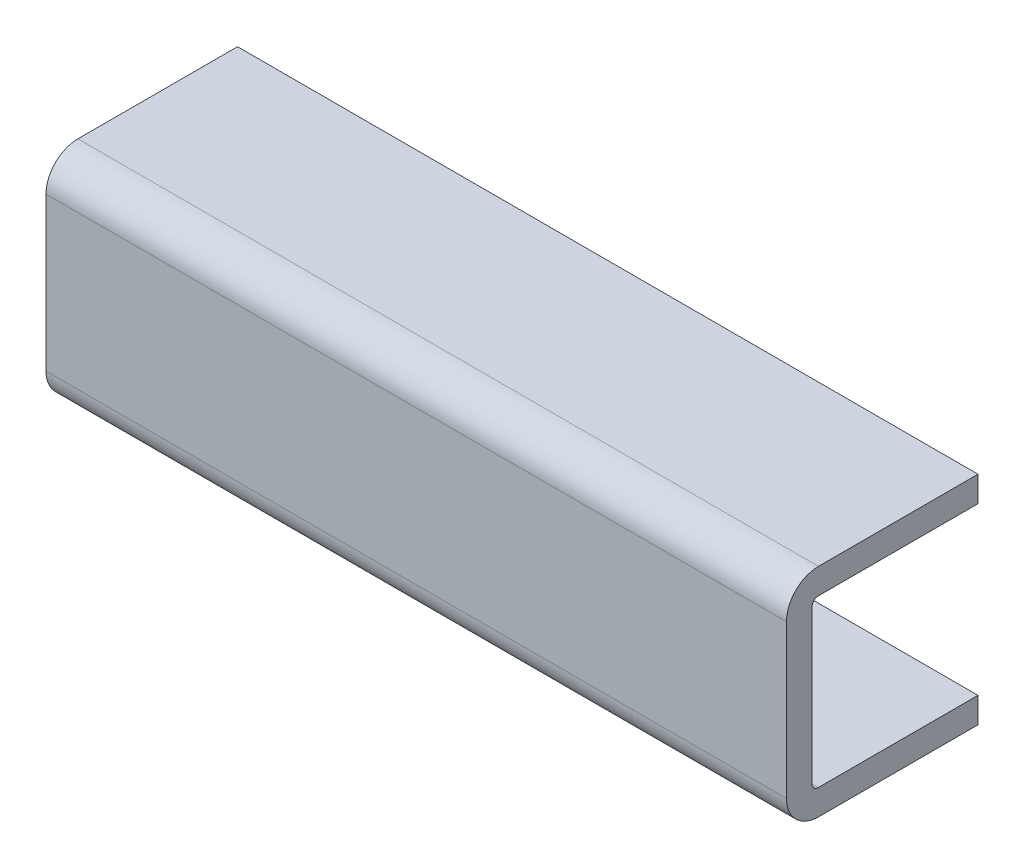
ISO-10303-21;
HEADER;
FILE_DESCRIPTION(('STEP AP214'),'2;1');
FILE_NAME('part.step','',(''),(''),'','','');
FILE_SCHEMA(('AUTOMOTIVE_DESIGN { 1 0 10303 214 1 1 1 1 }'));
ENDSEC;
DATA;
#1=APPLICATION_CONTEXT('core data for automotive mechanical design processes');
#2=APPLICATION_PROTOCOL_DEFINITION('international standard','automotive_design',2000,#1);
#3=PRODUCT_CONTEXT('',#1,'mechanical');
#4=PRODUCT('Part','Part','',(#3));
#5=PRODUCT_RELATED_PRODUCT_CATEGORY('part','',(#4));
#6=PRODUCT_DEFINITION_FORMATION('','',#4);
#7=PRODUCT_DEFINITION_CONTEXT('part definition',#1,'design');
#8=PRODUCT_DEFINITION('design','',#6,#7);
#9=PRODUCT_DEFINITION_SHAPE('','',#8);
#10=(LENGTH_UNIT() NAMED_UNIT(*) SI_UNIT(.MILLI.,.METRE.));
#11=(NAMED_UNIT(*) PLANE_ANGLE_UNIT() SI_UNIT($,.RADIAN.));
#12=(NAMED_UNIT(*) SI_UNIT($,.STERADIAN.) SOLID_ANGLE_UNIT());
#13=UNCERTAINTY_MEASURE_WITH_UNIT(LENGTH_MEASURE(1.E-05),#10,'distance_accuracy_value','');
#14=(GEOMETRIC_REPRESENTATION_CONTEXT(3) GLOBAL_UNCERTAINTY_ASSIGNED_CONTEXT((#13)) GLOBAL_UNIT_ASSIGNED_CONTEXT((#10,
#11,#12)) REPRESENTATION_CONTEXT('',''));
#15=CARTESIAN_POINT('',(0.,0.,0.));
#16=DIRECTION('',(0.,0.,1.));
#17=DIRECTION('',(1.,0.,0.));
#18=AXIS2_PLACEMENT_3D('',#15,#16,#17);
#19=CARTESIAN_POINT('',(92.075,26.9875,23.8125));
#20=DIRECTION('',(-1.,0.,0.));
#21=DIRECTION('',(0.,0.,1.));
#22=AXIS2_PLACEMENT_3D('',#19,#20,#21);
#23=PLANE('',#22);
#24=DIRECTION('',(0.,0.,-1.));
#25=VECTOR('',#24,1.);
#26=CARTESIAN_POINT('',(92.075,-20.6375,23.8125));
#27=LINE('',#26,#25);
#28=CARTESIAN_POINT('',(92.075,-20.6375,15.875));
#29=VERTEX_POINT('',#28);
#30=CARTESIAN_POINT('',(92.075,-20.6375,-23.8125));
#31=VERTEX_POINT('',#30);
#32=EDGE_CURVE('E55',#29,#31,#27,.T.);
#33=ORIENTED_EDGE('',*,*,#32,.F.);
#34=CARTESIAN_POINT('',(92.075,-19.05,15.875));
#35=DIRECTION('',(-1.,0.,0.));
#36=DIRECTION('',(0.,0.,1.));
#37=AXIS2_PLACEMENT_3D('',#34,#35,#36);
#38=CIRCLE('',#37,1.5875);
#39=CARTESIAN_POINT('',(92.075,-19.05,17.4625));
#40=VERTEX_POINT('',#39);
#41=EDGE_CURVE('E225',#40,#29,#38,.F.);
#42=ORIENTED_EDGE('',*,*,#41,.F.);
#43=DIRECTION('',(0.,1.,0.));
#44=VECTOR('',#43,1.);
#45=CARTESIAN_POINT('',(92.075,26.9875,17.4625));
#46=LINE('',#45,#44);
#47=CARTESIAN_POINT('',(92.075,19.05,17.4625));
#48=VERTEX_POINT('',#47);
#49=EDGE_CURVE('E241',#40,#48,#46,.T.);
#50=ORIENTED_EDGE('',*,*,#49,.T.);
#51=CARTESIAN_POINT('',(92.075,19.05,15.875));
#52=DIRECTION('',(-1.,0.,0.));
#53=DIRECTION('',(0.,0.,1.));
#54=AXIS2_PLACEMENT_3D('',#51,#52,#53);
#55=CIRCLE('',#54,1.5875);
#56=CARTESIAN_POINT('',(92.075,20.6375,15.875));
#57=VERTEX_POINT('',#56);
#58=EDGE_CURVE('E250',#57,#48,#55,.F.);
#59=ORIENTED_EDGE('',*,*,#58,.F.);
#60=DIRECTION('',(0.,0.,-1.));
#61=VECTOR('',#60,1.);
#62=CARTESIAN_POINT('',(92.075,20.6375,23.8125));
#63=LINE('',#62,#61);
#64=CARTESIAN_POINT('',(92.075,20.6375,-23.8125));
#65=VERTEX_POINT('',#64);
#66=EDGE_CURVE('E227',#57,#65,#63,.T.);
#67=ORIENTED_EDGE('',*,*,#66,.T.);
#68=DIRECTION('',(0.,1.,0.));
#69=VECTOR('',#68,1.);
#70=CARTESIAN_POINT('',(92.075,26.9875,-23.8125));
#71=LINE('',#70,#69);
#72=CARTESIAN_POINT('',(92.075,26.9875,-23.8125));
#73=VERTEX_POINT('',#72);
#74=EDGE_CURVE('E166',#65,#73,#71,.T.);
#75=ORIENTED_EDGE('',*,*,#74,.T.);
#76=DIRECTION('',(0.,0.,-1.));
#77=VECTOR('',#76,1.);
#78=CARTESIAN_POINT('',(92.075,26.9875,23.8125));
#79=LINE('',#78,#77);
#80=CARTESIAN_POINT('',(92.075,26.9875,15.875));
#81=VERTEX_POINT('',#80);
#82=EDGE_CURVE('E178',#81,#73,#79,.T.);
#83=ORIENTED_EDGE('',*,*,#82,.F.);
#84=CARTESIAN_POINT('',(92.075,19.05,15.875));
#85=DIRECTION('',(-1.,0.,0.));
#86=DIRECTION('',(0.,0.,1.));
#87=AXIS2_PLACEMENT_3D('',#84,#85,#86);
#88=CIRCLE('',#87,7.9375);
#89=CARTESIAN_POINT('',(92.075,19.05,23.8125));
#90=VERTEX_POINT('',#89);
#91=EDGE_CURVE('E196',#81,#90,#88,.F.);
#92=ORIENTED_EDGE('',*,*,#91,.T.);
#93=DIRECTION('',(0.,1.,0.));
#94=VECTOR('',#93,1.);
#95=CARTESIAN_POINT('',(92.075,26.9875,23.8125));
#96=LINE('',#95,#94);
#97=CARTESIAN_POINT('',(92.075,-19.05,23.8125));
#98=VERTEX_POINT('',#97);
#99=EDGE_CURVE('E162',#98,#90,#96,.T.);
#100=ORIENTED_EDGE('',*,*,#99,.F.);
#101=CARTESIAN_POINT('',(92.075,-19.05,15.875));
#102=DIRECTION('',(-1.,0.,0.));
#103=DIRECTION('',(0.,0.,1.));
#104=AXIS2_PLACEMENT_3D('',#101,#102,#103);
#105=CIRCLE('',#104,7.9375);
#106=CARTESIAN_POINT('',(92.075,-26.9875,15.875));
#107=VERTEX_POINT('',#106);
#108=EDGE_CURVE('E199',#98,#107,#105,.F.);
#109=ORIENTED_EDGE('',*,*,#108,.T.);
#110=DIRECTION('',(0.,0.,-1.));
#111=VECTOR('',#110,1.);
#112=CARTESIAN_POINT('',(92.075,-26.9875,23.8125));
#113=LINE('',#112,#111);
#114=CARTESIAN_POINT('',(92.075,-26.9875,-23.8125));
#115=VERTEX_POINT('',#114);
#116=EDGE_CURVE('E182',#107,#115,#113,.T.);
#117=ORIENTED_EDGE('',*,*,#116,.T.);
#118=EDGE_CURVE('E167',#115,#31,#71,.T.);
#119=ORIENTED_EDGE('',*,*,#118,.T.);
#120=EDGE_LOOP('',(#33,#42,#50,#59,#67,#75,#83,#92,#100,#109,#117,#119));
#121=FACE_BOUND('',#120,.T.);
#122=ADVANCED_FACE('F39',(#121),#23,.F.);
#123=CARTESIAN_POINT('',(-92.075,-26.9875,-23.8125));
#124=DIRECTION('',(0.,0.,1.));
#125=DIRECTION('',(1.,0.,0.));
#126=AXIS2_PLACEMENT_3D('',#123,#124,#125);
#127=PLANE('',#126);
#128=ORIENTED_EDGE('',*,*,#74,.F.);
#129=DIRECTION('',(-1.,0.,0.));
#130=VECTOR('',#129,1.);
#131=CARTESIAN_POINT('',(-92.075,20.6375,-23.8125));
#132=LINE('',#131,#130);
#133=CARTESIAN_POINT('',(-92.075,20.6375,-23.8125));
#134=VERTEX_POINT('',#133);
#135=EDGE_CURVE('E137',#65,#134,#132,.T.);
#136=ORIENTED_EDGE('',*,*,#135,.T.);
#137=DIRECTION('',(0.,-1.,0.));
#138=VECTOR('',#137,1.);
#139=CARTESIAN_POINT('',(-92.075,26.9875,-23.8125));
#140=LINE('',#139,#138);
#141=CARTESIAN_POINT('',(-92.075,26.9875,-23.8125));
#142=VERTEX_POINT('',#141);
#143=EDGE_CURVE('E153',#142,#134,#140,.T.);
#144=ORIENTED_EDGE('',*,*,#143,.F.);
#145=DIRECTION('',(-1.,0.,0.));
#146=VECTOR('',#145,1.);
#147=CARTESIAN_POINT('',(-92.075,26.9875,-23.8125));
#148=LINE('',#147,#146);
#149=EDGE_CURVE('E170',#73,#142,#148,.T.);
#150=ORIENTED_EDGE('',*,*,#149,.F.);
#151=EDGE_LOOP('',(#128,#136,#144,#150));
#152=FACE_BOUND('',#151,.T.);
#153=ADVANCED_FACE('F281',(#152),#127,.F.);
#154=CARTESIAN_POINT('',(-92.075,26.9875,23.8125));
#155=DIRECTION('',(1.,0.,0.));
#156=DIRECTION('',(0.,0.,-1.));
#157=AXIS2_PLACEMENT_3D('',#154,#155,#156);
#158=PLANE('',#157);
#159=CARTESIAN_POINT('',(-92.075,-19.05,15.875));
#160=DIRECTION('',(1.,0.,0.));
#161=DIRECTION('',(0.,0.,-1.));
#162=AXIS2_PLACEMENT_3D('',#159,#160,#161);
#163=CIRCLE('',#162,1.5875);
#164=CARTESIAN_POINT('',(-92.075,-20.6375,15.875));
#165=VERTEX_POINT('',#164);
#166=CARTESIAN_POINT('',(-92.075,-19.05,17.4625));
#167=VERTEX_POINT('',#166);
#168=EDGE_CURVE('E144',#165,#167,#163,.F.);
#169=ORIENTED_EDGE('',*,*,#168,.F.);
#170=DIRECTION('',(0.,0.,-1.));
#171=VECTOR('',#170,1.);
#172=CARTESIAN_POINT('',(-92.075,-20.6375,23.8125));
#173=LINE('',#172,#171);
#174=CARTESIAN_POINT('',(-92.075,-20.6375,-23.8125));
#175=VERTEX_POINT('',#174);
#176=EDGE_CURVE('E130',#165,#175,#173,.T.);
#177=ORIENTED_EDGE('',*,*,#176,.T.);
#178=CARTESIAN_POINT('',(-92.075,-26.9875,-23.8125));
#179=VERTEX_POINT('',#178);
#180=EDGE_CURVE('E141',#175,#179,#140,.T.);
#181=ORIENTED_EDGE('',*,*,#180,.T.);
#182=DIRECTION('',(0.,0.,-1.));
#183=VECTOR('',#182,1.);
#184=CARTESIAN_POINT('',(-92.075,-26.9875,23.8125));
#185=LINE('',#184,#183);
#186=CARTESIAN_POINT('',(-92.075,-26.9875,15.875));
#187=VERTEX_POINT('',#186);
#188=EDGE_CURVE('E185',#187,#179,#185,.T.);
#189=ORIENTED_EDGE('',*,*,#188,.F.);
#190=CARTESIAN_POINT('',(-92.075,-19.05,15.875));
#191=DIRECTION('',(1.,0.,0.));
#192=DIRECTION('',(0.,0.,-1.));
#193=AXIS2_PLACEMENT_3D('',#190,#191,#192);
#194=CIRCLE('',#193,7.9375);
#195=CARTESIAN_POINT('',(-92.075,-19.05,23.8125));
#196=VERTEX_POINT('',#195);
#197=EDGE_CURVE('E48',#187,#196,#194,.F.);
#198=ORIENTED_EDGE('',*,*,#197,.T.);
#199=DIRECTION('',(0.,-1.,0.));
#200=VECTOR('',#199,1.);
#201=CARTESIAN_POINT('',(-92.075,26.9875,23.8125));
#202=LINE('',#201,#200);
#203=CARTESIAN_POINT('',(-92.075,19.05,23.8125));
#204=VERTEX_POINT('',#203);
#205=EDGE_CURVE('E174',#204,#196,#202,.T.);
#206=ORIENTED_EDGE('',*,*,#205,.F.);
#207=CARTESIAN_POINT('',(-92.075,19.05,15.875));
#208=DIRECTION('',(1.,0.,0.));
#209=DIRECTION('',(0.,0.,-1.));
#210=AXIS2_PLACEMENT_3D('',#207,#208,#209);
#211=CIRCLE('',#210,7.9375);
#212=CARTESIAN_POINT('',(-92.075,26.9875,15.875));
#213=VERTEX_POINT('',#212);
#214=EDGE_CURVE('E63',#204,#213,#211,.F.);
#215=ORIENTED_EDGE('',*,*,#214,.T.);
#216=DIRECTION('',(0.,0.,-1.));
#217=VECTOR('',#216,1.);
#218=CARTESIAN_POINT('',(-92.075,26.9875,23.8125));
#219=LINE('',#218,#217);
#220=EDGE_CURVE('E175',#213,#142,#219,.T.);
#221=ORIENTED_EDGE('',*,*,#220,.T.);
#222=ORIENTED_EDGE('',*,*,#143,.T.);
#223=DIRECTION('',(0.,0.,-1.));
#224=VECTOR('',#223,1.);
#225=CARTESIAN_POINT('',(-92.075,20.6375,23.8125));
#226=LINE('',#225,#224);
#227=CARTESIAN_POINT('',(-92.075,20.6375,15.875));
#228=VERTEX_POINT('',#227);
#229=EDGE_CURVE('E231',#228,#134,#226,.T.);
#230=ORIENTED_EDGE('',*,*,#229,.F.);
#231=CARTESIAN_POINT('',(-92.075,19.05,15.875));
#232=DIRECTION('',(1.,0.,0.));
#233=DIRECTION('',(0.,0.,-1.));
#234=AXIS2_PLACEMENT_3D('',#231,#232,#233);
#235=CIRCLE('',#234,1.5875);
#236=CARTESIAN_POINT('',(-92.075,19.05,17.4625));
#237=VERTEX_POINT('',#236);
#238=EDGE_CURVE('E237',#237,#228,#235,.F.);
#239=ORIENTED_EDGE('',*,*,#238,.F.);
#240=DIRECTION('',(0.,-1.,0.));
#241=VECTOR('',#240,1.);
#242=CARTESIAN_POINT('',(-92.075,26.9875,17.4625));
#243=LINE('',#242,#241);
#244=EDGE_CURVE('E238',#237,#167,#243,.T.);
#245=ORIENTED_EDGE('',*,*,#244,.T.);
#246=EDGE_LOOP('',(#169,#177,#181,#189,#198,#206,#215,#221,#222,#230,#239,#245));
#247=FACE_BOUND('',#246,.T.);
#248=ADVANCED_FACE('F139',(#247),#158,.F.);
#249=CARTESIAN_POINT('',(-92.075,-26.9875,23.8125));
#250=DIRECTION('',(0.,1.,0.));
#251=DIRECTION('',(0.,0.,1.));
#252=AXIS2_PLACEMENT_3D('',#249,#250,#251);
#253=PLANE('',#252);
#254=ORIENTED_EDGE('',*,*,#116,.F.);
#255=DIRECTION('',(1.,0.,0.));
#256=VECTOR('',#255,1.);
#257=CARTESIAN_POINT('',(-92.075,-26.9875,15.875));
#258=LINE('',#257,#256);
#259=EDGE_CURVE('E202',#107,#187,#258,.F.);
#260=ORIENTED_EDGE('',*,*,#259,.T.);
#261=ORIENTED_EDGE('',*,*,#188,.T.);
#262=DIRECTION('',(1.,0.,0.));
#263=VECTOR('',#262,1.);
#264=CARTESIAN_POINT('',(-92.075,-26.9875,-23.8125));
#265=LINE('',#264,#263);
#266=EDGE_CURVE('E151',#179,#115,#265,.T.);
#267=ORIENTED_EDGE('',*,*,#266,.T.);
#268=EDGE_LOOP('',(#254,#260,#261,#267));
#269=FACE_BOUND('',#268,.T.);
#270=ADVANCED_FACE('F222',(#269),#253,.F.);
#271=CARTESIAN_POINT('',(-92.075,26.9875,23.8125));
#272=DIRECTION('',(0.,-1.,0.));
#273=DIRECTION('',(0.,0.,-1.));
#274=AXIS2_PLACEMENT_3D('',#271,#272,#273);
#275=PLANE('',#274);
#276=ORIENTED_EDGE('',*,*,#220,.F.);
#277=DIRECTION('',(-1.,0.,0.));
#278=VECTOR('',#277,1.);
#279=CARTESIAN_POINT('',(92.075,26.9875,15.875));
#280=LINE('',#279,#278);
#281=EDGE_CURVE('E11',#213,#81,#280,.F.);
#282=ORIENTED_EDGE('',*,*,#281,.T.);
#283=ORIENTED_EDGE('',*,*,#82,.T.);
#284=ORIENTED_EDGE('',*,*,#149,.T.);
#285=EDGE_LOOP('',(#276,#282,#283,#284));
#286=FACE_BOUND('',#285,.T.);
#287=ADVANCED_FACE('F290',(#286),#275,.F.);
#288=CARTESIAN_POINT('',(-92.075,-26.9875,23.8125));
#289=DIRECTION('',(0.,0.,1.));
#290=DIRECTION('',(1.,0.,0.));
#291=AXIS2_PLACEMENT_3D('',#288,#289,#290);
#292=PLANE('',#291);
#293=ORIENTED_EDGE('',*,*,#205,.T.);
#294=DIRECTION('',(1.,0.,0.));
#295=VECTOR('',#294,1.);
#296=CARTESIAN_POINT('',(92.075,-19.05,23.8125));
#297=LINE('',#296,#295);
#298=EDGE_CURVE('E192',#196,#98,#297,.T.);
#299=ORIENTED_EDGE('',*,*,#298,.T.);
#300=ORIENTED_EDGE('',*,*,#99,.T.);
#301=DIRECTION('',(-1.,0.,0.));
#302=VECTOR('',#301,1.);
#303=CARTESIAN_POINT('',(-92.075,19.05,23.8125));
#304=LINE('',#303,#302);
#305=EDGE_CURVE('E188',#90,#204,#304,.T.);
#306=ORIENTED_EDGE('',*,*,#305,.T.);
#307=EDGE_LOOP('',(#293,#299,#300,#306));
#308=FACE_BOUND('',#307,.T.);
#309=ADVANCED_FACE('F213',(#308),#292,.T.);
#310=ORIENTED_EDGE('',*,*,#180,.F.);
#311=DIRECTION('',(1.,0.,0.));
#312=VECTOR('',#311,1.);
#313=CARTESIAN_POINT('',(-92.075,-20.6375,-23.8125));
#314=LINE('',#313,#312);
#315=EDGE_CURVE('E127',#175,#31,#314,.T.);
#316=ORIENTED_EDGE('',*,*,#315,.T.);
#317=ORIENTED_EDGE('',*,*,#118,.F.);
#318=ORIENTED_EDGE('',*,*,#266,.F.);
#319=EDGE_LOOP('',(#310,#316,#317,#318));
#320=FACE_BOUND('',#319,.T.);
#321=ADVANCED_FACE('F149',(#320),#127,.F.);
#322=CARTESIAN_POINT('',(-92.075,-19.05,15.875));
#323=DIRECTION('',(-1.,0.,0.));
#324=DIRECTION('',(0.,0.,1.));
#325=AXIS2_PLACEMENT_3D('',#322,#323,#324);
#326=CYLINDRICAL_SURFACE('',#325,7.9375);
#327=ORIENTED_EDGE('',*,*,#197,.F.);
#328=ORIENTED_EDGE('',*,*,#259,.F.);
#329=ORIENTED_EDGE('',*,*,#108,.F.);
#330=ORIENTED_EDGE('',*,*,#298,.F.);
#331=EDGE_LOOP('',(#327,#328,#329,#330));
#332=FACE_BOUND('',#331,.T.);
#333=ADVANCED_FACE('F218',(#332),#326,.T.);
#334=CARTESIAN_POINT('',(-92.075,19.05,15.875));
#335=DIRECTION('',(1.,0.,0.));
#336=DIRECTION('',(0.,0.,-1.));
#337=AXIS2_PLACEMENT_3D('',#334,#335,#336);
#338=CYLINDRICAL_SURFACE('',#337,7.9375);
#339=ORIENTED_EDGE('',*,*,#91,.F.);
#340=ORIENTED_EDGE('',*,*,#281,.F.);
#341=ORIENTED_EDGE('',*,*,#214,.F.);
#342=ORIENTED_EDGE('',*,*,#305,.F.);
#343=EDGE_LOOP('',(#339,#340,#341,#342));
#344=FACE_BOUND('',#343,.T.);
#345=ADVANCED_FACE('F41',(#344),#338,.T.);
#346=CARTESIAN_POINT('',(-92.075,-20.6375,23.8125));
#347=DIRECTION('',(0.,1.,0.));
#348=DIRECTION('',(0.,0.,1.));
#349=AXIS2_PLACEMENT_3D('',#346,#347,#348);
#350=PLANE('',#349);
#351=ORIENTED_EDGE('',*,*,#32,.T.);
#352=ORIENTED_EDGE('',*,*,#315,.F.);
#353=ORIENTED_EDGE('',*,*,#176,.F.);
#354=DIRECTION('',(1.,0.,0.));
#355=VECTOR('',#354,1.);
#356=CARTESIAN_POINT('',(-92.075,-20.6375,15.875));
#357=LINE('',#356,#355);
#358=EDGE_CURVE('E244',#29,#165,#357,.F.);
#359=ORIENTED_EDGE('',*,*,#358,.F.);
#360=EDGE_LOOP('',(#351,#352,#353,#359));
#361=FACE_BOUND('',#360,.T.);
#362=ADVANCED_FACE('F129',(#361),#350,.T.);
#363=CARTESIAN_POINT('',(-92.075,20.6375,23.8125));
#364=DIRECTION('',(0.,-1.,0.));
#365=DIRECTION('',(0.,0.,-1.));
#366=AXIS2_PLACEMENT_3D('',#363,#364,#365);
#367=PLANE('',#366);
#368=ORIENTED_EDGE('',*,*,#229,.T.);
#369=ORIENTED_EDGE('',*,*,#135,.F.);
#370=ORIENTED_EDGE('',*,*,#66,.F.);
#371=DIRECTION('',(1.,0.,0.));
#372=VECTOR('',#371,1.);
#373=CARTESIAN_POINT('',(-92.075,20.6375,15.875));
#374=LINE('',#373,#372);
#375=EDGE_CURVE('E154',#228,#57,#374,.T.);
#376=ORIENTED_EDGE('',*,*,#375,.F.);
#377=EDGE_LOOP('',(#368,#369,#370,#376));
#378=FACE_BOUND('',#377,.T.);
#379=ADVANCED_FACE('F277',(#378),#367,.T.);
#380=CARTESIAN_POINT('',(-92.075,-26.9875,17.4625));
#381=DIRECTION('',(0.,0.,1.));
#382=DIRECTION('',(1.,0.,0.));
#383=AXIS2_PLACEMENT_3D('',#380,#381,#382);
#384=PLANE('',#383);
#385=ORIENTED_EDGE('',*,*,#244,.F.);
#386=DIRECTION('',(1.,0.,0.));
#387=VECTOR('',#386,1.);
#388=CARTESIAN_POINT('',(-92.075,19.05,17.4625));
#389=LINE('',#388,#387);
#390=EDGE_CURVE('E146',#48,#237,#389,.F.);
#391=ORIENTED_EDGE('',*,*,#390,.F.);
#392=ORIENTED_EDGE('',*,*,#49,.F.);
#393=DIRECTION('',(1.,0.,0.));
#394=VECTOR('',#393,1.);
#395=CARTESIAN_POINT('',(-92.075,-19.05,17.4625));
#396=LINE('',#395,#394);
#397=EDGE_CURVE('E253',#167,#40,#396,.T.);
#398=ORIENTED_EDGE('',*,*,#397,.F.);
#399=EDGE_LOOP('',(#385,#391,#392,#398));
#400=FACE_BOUND('',#399,.T.);
#401=ADVANCED_FACE('F273',(#400),#384,.F.);
#402=CARTESIAN_POINT('',(-92.075,-19.05,15.875));
#403=DIRECTION('',(-1.,0.,0.));
#404=DIRECTION('',(0.,0.,1.));
#405=AXIS2_PLACEMENT_3D('',#402,#403,#404);
#406=CYLINDRICAL_SURFACE('',#405,1.5875);
#407=ORIENTED_EDGE('',*,*,#168,.T.);
#408=ORIENTED_EDGE('',*,*,#397,.T.);
#409=ORIENTED_EDGE('',*,*,#41,.T.);
#410=ORIENTED_EDGE('',*,*,#358,.T.);
#411=EDGE_LOOP('',(#407,#408,#409,#410));
#412=FACE_BOUND('',#411,.T.);
#413=ADVANCED_FACE('F317',(#412),#406,.F.);
#414=CARTESIAN_POINT('',(-92.075,19.05,15.875));
#415=DIRECTION('',(1.,0.,0.));
#416=DIRECTION('',(0.,0.,-1.));
#417=AXIS2_PLACEMENT_3D('',#414,#415,#416);
#418=CYLINDRICAL_SURFACE('',#417,1.5875);
#419=ORIENTED_EDGE('',*,*,#58,.T.);
#420=ORIENTED_EDGE('',*,*,#390,.T.);
#421=ORIENTED_EDGE('',*,*,#238,.T.);
#422=ORIENTED_EDGE('',*,*,#375,.T.);
#423=EDGE_LOOP('',(#419,#420,#421,#422));
#424=FACE_BOUND('',#423,.T.);
#425=ADVANCED_FACE('F266',(#424),#418,.F.);
#426=CLOSED_SHELL('',(#122,#153,#248,#270,#287,#309,#321,#333,#345,#362,#379,#401,#413,#425));
#427=MANIFOLD_SOLID_BREP('B2',#426);
#428=ADVANCED_BREP_SHAPE_REPRESENTATION('',(#18,#427),#14);
#429=SHAPE_DEFINITION_REPRESENTATION(#9,#428);
ENDSEC;
END-ISO-10303-21;
